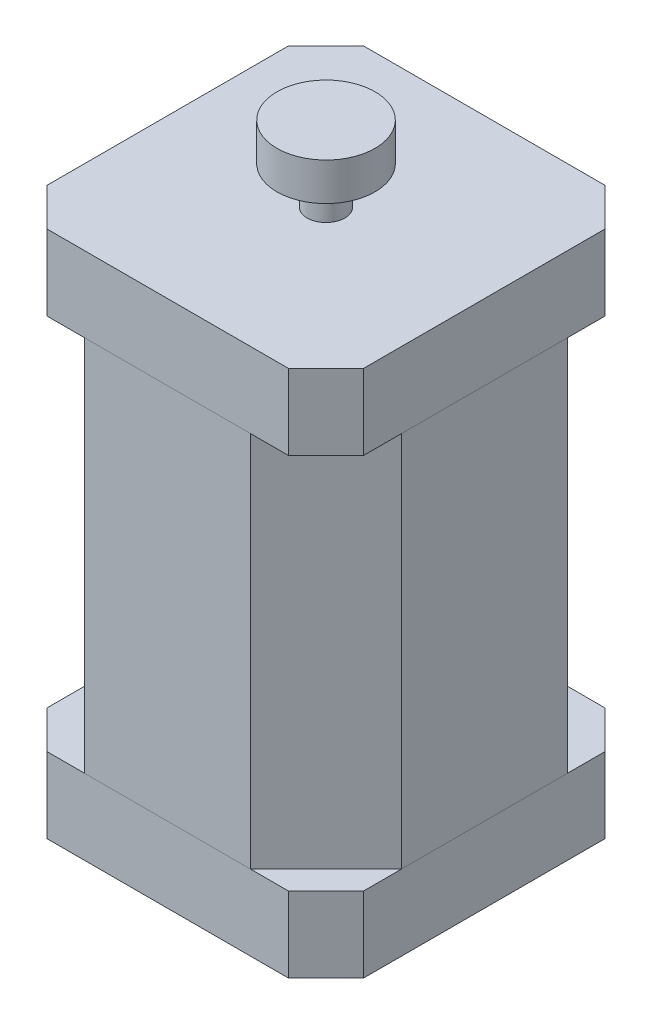
ISO-10303-21;
HEADER;
FILE_DESCRIPTION(('STEP AP214'),'2;1');
FILE_NAME('part.step','',(''),(''),'','','');
FILE_SCHEMA(('AUTOMOTIVE_DESIGN { 1 0 10303 214 1 1 1 1 }'));
ENDSEC;
DATA;
#1=APPLICATION_CONTEXT('core data for automotive mechanical design processes');
#2=APPLICATION_PROTOCOL_DEFINITION('international standard','automotive_design',2000,#1);
#3=PRODUCT_CONTEXT('',#1,'mechanical');
#4=PRODUCT('Part','Part','',(#3));
#5=PRODUCT_RELATED_PRODUCT_CATEGORY('part','',(#4));
#6=PRODUCT_DEFINITION_FORMATION('','',#4);
#7=PRODUCT_DEFINITION_CONTEXT('part definition',#1,'design');
#8=PRODUCT_DEFINITION('design','',#6,#7);
#9=PRODUCT_DEFINITION_SHAPE('','',#8);
#10=(LENGTH_UNIT() NAMED_UNIT(*) SI_UNIT(.MILLI.,.METRE.));
#11=(NAMED_UNIT(*) PLANE_ANGLE_UNIT() SI_UNIT($,.RADIAN.));
#12=(NAMED_UNIT(*) SI_UNIT($,.STERADIAN.) SOLID_ANGLE_UNIT());
#13=UNCERTAINTY_MEASURE_WITH_UNIT(LENGTH_MEASURE(1.E-05),#10,'distance_accuracy_value','');
#14=(GEOMETRIC_REPRESENTATION_CONTEXT(3) GLOBAL_UNCERTAINTY_ASSIGNED_CONTEXT((#13)) GLOBAL_UNIT_ASSIGNED_CONTEXT((#10,
#11,#12)) REPRESENTATION_CONTEXT('',''));
#15=CARTESIAN_POINT('',(0.,0.,0.));
#16=DIRECTION('',(0.,0.,1.));
#17=DIRECTION('',(1.,0.,0.));
#18=AXIS2_PLACEMENT_3D('',#15,#16,#17);
#19=CARTESIAN_POINT('',(0.,-10.,0.));
#20=DIRECTION('',(1.,0.,0.));
#21=DIRECTION('',(0.,0.,-1.));
#22=AXIS2_PLACEMENT_3D('',#19,#20,#21);
#23=PLANE('',#22);
#24=DIRECTION('',(0.,0.,-1.));
#25=VECTOR('',#24,1.);
#26=CARTESIAN_POINT('',(0.,0.,0.));
#27=LINE('',#26,#25);
#28=CARTESIAN_POINT('',(0.,0.,37.));
#29=VERTEX_POINT('',#28);
#30=CARTESIAN_POINT('',(0.,0.,5.00000000000002));
#31=VERTEX_POINT('',#30);
#32=EDGE_CURVE('E139',#29,#31,#27,.T.);
#33=ORIENTED_EDGE('',*,*,#32,.T.);
#34=DIRECTION('',(0.,-1.,0.));
#35=VECTOR('',#34,1.);
#36=CARTESIAN_POINT('',(0.,-10.,5.00000000000002));
#37=LINE('',#36,#35);
#38=CARTESIAN_POINT('',(0.,-10.,5.00000000000002));
#39=VERTEX_POINT('',#38);
#40=EDGE_CURVE('E116',#31,#39,#37,.T.);
#41=ORIENTED_EDGE('',*,*,#40,.T.);
#42=DIRECTION('',(0.,0.,-1.));
#43=VECTOR('',#42,1.);
#44=CARTESIAN_POINT('',(0.,-10.,0.));
#45=LINE('',#44,#43);
#46=CARTESIAN_POINT('',(0.,-10.,37.));
#47=VERTEX_POINT('',#46);
#48=EDGE_CURVE('E148',#47,#39,#45,.T.);
#49=ORIENTED_EDGE('',*,*,#48,.F.);
#50=DIRECTION('',(0.,1.,0.));
#51=VECTOR('',#50,1.);
#52=CARTESIAN_POINT('',(0.,-10.,37.));
#53=LINE('',#52,#51);
#54=EDGE_CURVE('E121',#47,#29,#53,.T.);
#55=ORIENTED_EDGE('',*,*,#54,.T.);
#56=EDGE_LOOP('',(#33,#41,#49,#55));
#57=FACE_BOUND('',#56,.T.);
#58=ADVANCED_FACE('F44',(#57),#23,.F.);
#59=CARTESIAN_POINT('',(0.,-10.,0.));
#60=DIRECTION('',(0.,0.,1.));
#61=DIRECTION('',(1.,0.,0.));
#62=AXIS2_PLACEMENT_3D('',#59,#60,#61);
#63=PLANE('',#62);
#64=DIRECTION('',(1.,0.,0.));
#65=VECTOR('',#64,1.);
#66=CARTESIAN_POINT('',(0.,-10.,0.));
#67=LINE('',#66,#65);
#68=CARTESIAN_POINT('',(5.,-10.,0.));
#69=VERTEX_POINT('',#68);
#70=CARTESIAN_POINT('',(37.,-10.,0.));
#71=VERTEX_POINT('',#70);
#72=EDGE_CURVE('E131',#69,#71,#67,.T.);
#73=ORIENTED_EDGE('',*,*,#72,.F.);
#74=DIRECTION('',(0.,1.,0.));
#75=VECTOR('',#74,1.);
#76=CARTESIAN_POINT('',(5.,-10.,0.));
#77=LINE('',#76,#75);
#78=CARTESIAN_POINT('',(5.,0.,0.));
#79=VERTEX_POINT('',#78);
#80=EDGE_CURVE('E115',#69,#79,#77,.T.);
#81=ORIENTED_EDGE('',*,*,#80,.T.);
#82=DIRECTION('',(1.,0.,0.));
#83=VECTOR('',#82,1.);
#84=CARTESIAN_POINT('',(0.,0.,0.));
#85=LINE('',#84,#83);
#86=CARTESIAN_POINT('',(37.,0.,0.));
#87=VERTEX_POINT('',#86);
#88=EDGE_CURVE('E128',#79,#87,#85,.T.);
#89=ORIENTED_EDGE('',*,*,#88,.T.);
#90=DIRECTION('',(0.,-1.,0.));
#91=VECTOR('',#90,1.);
#92=CARTESIAN_POINT('',(37.,-10.,0.));
#93=LINE('',#92,#91);
#94=EDGE_CURVE('E133',#87,#71,#93,.T.);
#95=ORIENTED_EDGE('',*,*,#94,.T.);
#96=EDGE_LOOP('',(#73,#81,#89,#95));
#97=FACE_BOUND('',#96,.T.);
#98=ADVANCED_FACE('F127',(#97),#63,.F.);
#99=CARTESIAN_POINT('',(42.,-10.,0.));
#100=DIRECTION('',(-1.,0.,0.));
#101=DIRECTION('',(0.,0.,1.));
#102=AXIS2_PLACEMENT_3D('',#99,#100,#101);
#103=PLANE('',#102);
#104=DIRECTION('',(0.,0.,1.));
#105=VECTOR('',#104,1.);
#106=CARTESIAN_POINT('',(42.,-10.,0.));
#107=LINE('',#106,#105);
#108=CARTESIAN_POINT('',(42.,-10.,5.));
#109=VERTEX_POINT('',#108);
#110=CARTESIAN_POINT('',(42.,-10.,37.));
#111=VERTEX_POINT('',#110);
#112=EDGE_CURVE('E171',#109,#111,#107,.T.);
#113=ORIENTED_EDGE('',*,*,#112,.F.);
#114=DIRECTION('',(0.,1.,0.));
#115=VECTOR('',#114,1.);
#116=CARTESIAN_POINT('',(42.,-10.,5.));
#117=LINE('',#116,#115);
#118=CARTESIAN_POINT('',(42.,0.,5.00000000000001));
#119=VERTEX_POINT('',#118);
#120=EDGE_CURVE('E12',#109,#119,#117,.T.);
#121=ORIENTED_EDGE('',*,*,#120,.T.);
#122=DIRECTION('',(0.,0.,1.));
#123=VECTOR('',#122,1.);
#124=CARTESIAN_POINT('',(42.,0.,0.));
#125=LINE('',#124,#123);
#126=CARTESIAN_POINT('',(42.,0.,37.));
#127=VERTEX_POINT('',#126);
#128=EDGE_CURVE('E138',#119,#127,#125,.T.);
#129=ORIENTED_EDGE('',*,*,#128,.T.);
#130=DIRECTION('',(0.,-1.,0.));
#131=VECTOR('',#130,1.);
#132=CARTESIAN_POINT('',(42.,-10.,37.));
#133=LINE('',#132,#131);
#134=EDGE_CURVE('E52',#127,#111,#133,.T.);
#135=ORIENTED_EDGE('',*,*,#134,.T.);
#136=EDGE_LOOP('',(#113,#121,#129,#135));
#137=FACE_BOUND('',#136,.T.);
#138=ADVANCED_FACE('F170',(#137),#103,.F.);
#139=CARTESIAN_POINT('',(0.,-10.,42.));
#140=DIRECTION('',(0.,0.,-1.));
#141=DIRECTION('',(-1.,0.,0.));
#142=AXIS2_PLACEMENT_3D('',#139,#140,#141);
#143=PLANE('',#142);
#144=DIRECTION('',(-1.,0.,0.));
#145=VECTOR('',#144,1.);
#146=CARTESIAN_POINT('',(0.,0.,42.));
#147=LINE('',#146,#145);
#148=CARTESIAN_POINT('',(37.,0.,42.));
#149=VERTEX_POINT('',#148);
#150=CARTESIAN_POINT('',(5.00000000000002,0.,42.));
#151=VERTEX_POINT('',#150);
#152=EDGE_CURVE('E142',#149,#151,#147,.T.);
#153=ORIENTED_EDGE('',*,*,#152,.T.);
#154=DIRECTION('',(0.,-1.,0.));
#155=VECTOR('',#154,1.);
#156=CARTESIAN_POINT('',(5.00000000000002,-10.,42.));
#157=LINE('',#156,#155);
#158=CARTESIAN_POINT('',(5.00000000000003,-10.,42.));
#159=VERTEX_POINT('',#158);
#160=EDGE_CURVE('E59',#151,#159,#157,.T.);
#161=ORIENTED_EDGE('',*,*,#160,.T.);
#162=DIRECTION('',(-1.,0.,0.));
#163=VECTOR('',#162,1.);
#164=CARTESIAN_POINT('',(0.,-10.,42.));
#165=LINE('',#164,#163);
#166=CARTESIAN_POINT('',(37.,-10.,42.));
#167=VERTEX_POINT('',#166);
#168=EDGE_CURVE('E149',#167,#159,#165,.T.);
#169=ORIENTED_EDGE('',*,*,#168,.F.);
#170=DIRECTION('',(0.,1.,0.));
#171=VECTOR('',#170,1.);
#172=CARTESIAN_POINT('',(37.,-10.,42.));
#173=LINE('',#172,#171);
#174=EDGE_CURVE('E164',#167,#149,#173,.T.);
#175=ORIENTED_EDGE('',*,*,#174,.T.);
#176=EDGE_LOOP('',(#153,#161,#169,#175));
#177=FACE_BOUND('',#176,.T.);
#178=ADVANCED_FACE('F180',(#177),#143,.F.);
#179=CARTESIAN_POINT('',(0.,-10.,0.));
#180=DIRECTION('',(0.,1.,0.));
#181=DIRECTION('',(0.,0.,1.));
#182=AXIS2_PLACEMENT_3D('',#179,#180,#181);
#183=PLANE('',#182);
#184=ORIENTED_EDGE('',*,*,#48,.T.);
#185=DIRECTION('',(-0.707106781186547,0.,0.707106781186549));
#186=VECTOR('',#185,1.);
#187=CARTESIAN_POINT('',(5.,-10.,0.));
#188=LINE('',#187,#186);
#189=EDGE_CURVE('E162',#39,#69,#188,.F.);
#190=ORIENTED_EDGE('',*,*,#189,.T.);
#191=ORIENTED_EDGE('',*,*,#72,.T.);
#192=DIRECTION('',(-0.707106781186549,0.,-0.707106781186547));
#193=VECTOR('',#192,1.);
#194=CARTESIAN_POINT('',(42.,-10.,5.));
#195=LINE('',#194,#193);
#196=EDGE_CURVE('E158',#71,#109,#195,.F.);
#197=ORIENTED_EDGE('',*,*,#196,.T.);
#198=ORIENTED_EDGE('',*,*,#112,.T.);
#199=DIRECTION('',(0.707106781186546,0.,-0.70710678118655));
#200=VECTOR('',#199,1.);
#201=CARTESIAN_POINT('',(37.,-10.,42.));
#202=LINE('',#201,#200);
#203=EDGE_CURVE('E66',#111,#167,#202,.F.);
#204=ORIENTED_EDGE('',*,*,#203,.T.);
#205=ORIENTED_EDGE('',*,*,#168,.T.);
#206=DIRECTION('',(0.70710678118655,0.,0.707106781186546));
#207=VECTOR('',#206,1.);
#208=CARTESIAN_POINT('',(0.,-10.,37.));
#209=LINE('',#208,#207);
#210=EDGE_CURVE('E160',#159,#47,#209,.F.);
#211=ORIENTED_EDGE('',*,*,#210,.T.);
#212=EDGE_LOOP('',(#184,#190,#191,#197,#198,#204,#205,#211));
#213=FACE_BOUND('',#212,.T.);
#214=ADVANCED_FACE('F175',(#213),#183,.F.);
#215=CARTESIAN_POINT('',(0.,0.,0.));
#216=DIRECTION('',(0.,1.,0.));
#217=DIRECTION('',(0.,0.,1.));
#218=AXIS2_PLACEMENT_3D('',#215,#216,#217);
#219=PLANE('',#218);
#220=ORIENTED_EDGE('',*,*,#88,.F.);
#221=DIRECTION('',(0.707106781186547,0.,-0.707106781186549));
#222=VECTOR('',#221,1.);
#223=CARTESIAN_POINT('',(2.50000000000001,0.,2.5));
#224=LINE('',#223,#222);
#225=EDGE_CURVE('E111',#79,#31,#224,.F.);
#226=ORIENTED_EDGE('',*,*,#225,.T.);
#227=ORIENTED_EDGE('',*,*,#32,.F.);
#228=DIRECTION('',(-0.70710678118655,0.,-0.707106781186546));
#229=VECTOR('',#228,1.);
#230=CARTESIAN_POINT('',(-18.5,0.,18.5000000000001));
#231=LINE('',#230,#229);
#232=EDGE_CURVE('E122',#29,#151,#231,.F.);
#233=ORIENTED_EDGE('',*,*,#232,.T.);
#234=ORIENTED_EDGE('',*,*,#152,.F.);
#235=DIRECTION('',(-0.707106781186546,0.,0.70710678118655));
#236=VECTOR('',#235,1.);
#237=CARTESIAN_POINT('',(39.5000000000001,0.,39.4999999999999));
#238=LINE('',#237,#236);
#239=EDGE_CURVE('E132',#149,#127,#238,.F.);
#240=ORIENTED_EDGE('',*,*,#239,.T.);
#241=ORIENTED_EDGE('',*,*,#128,.F.);
#242=DIRECTION('',(0.707106781186549,0.,0.707106781186547));
#243=VECTOR('',#242,1.);
#244=CARTESIAN_POINT('',(18.4999999999999,0.,-18.5));
#245=LINE('',#244,#243);
#246=EDGE_CURVE('E137',#119,#87,#245,.F.);
#247=ORIENTED_EDGE('',*,*,#246,.T.);
#248=EDGE_LOOP('',(#220,#226,#227,#233,#234,#240,#241,#247));
#249=FACE_BOUND('',#248,.T.);
#250=ADVANCED_FACE('F135',(#249),#219,.T.);
#251=CARTESIAN_POINT('',(5.,-10.,0.));
#252=DIRECTION('',(0.707106781186549,0.,0.707106781186547));
#253=DIRECTION('',(0.,1.,0.));
#254=AXIS2_PLACEMENT_3D('',#251,#252,#253);
#255=PLANE('',#254);
#256=ORIENTED_EDGE('',*,*,#189,.F.);
#257=ORIENTED_EDGE('',*,*,#40,.F.);
#258=ORIENTED_EDGE('',*,*,#225,.F.);
#259=ORIENTED_EDGE('',*,*,#80,.F.);
#260=EDGE_LOOP('',(#256,#257,#258,#259));
#261=FACE_BOUND('',#260,.T.);
#262=ADVANCED_FACE('F114',(#261),#255,.F.);
#263=CARTESIAN_POINT('',(0.,-10.,37.));
#264=DIRECTION('',(0.707106781186546,0.,-0.70710678118655));
#265=DIRECTION('',(0.,1.,0.));
#266=AXIS2_PLACEMENT_3D('',#263,#264,#265);
#267=PLANE('',#266);
#268=ORIENTED_EDGE('',*,*,#210,.F.);
#269=ORIENTED_EDGE('',*,*,#160,.F.);
#270=ORIENTED_EDGE('',*,*,#232,.F.);
#271=ORIENTED_EDGE('',*,*,#54,.F.);
#272=EDGE_LOOP('',(#268,#269,#270,#271));
#273=FACE_BOUND('',#272,.T.);
#274=ADVANCED_FACE('F184',(#273),#267,.F.);
#275=CARTESIAN_POINT('',(42.,-10.,5.));
#276=DIRECTION('',(-0.707106781186547,0.,0.707106781186549));
#277=DIRECTION('',(0.,1.,0.));
#278=AXIS2_PLACEMENT_3D('',#275,#276,#277);
#279=PLANE('',#278);
#280=ORIENTED_EDGE('',*,*,#196,.F.);
#281=ORIENTED_EDGE('',*,*,#94,.F.);
#282=ORIENTED_EDGE('',*,*,#246,.F.);
#283=ORIENTED_EDGE('',*,*,#120,.F.);
#284=EDGE_LOOP('',(#280,#281,#282,#283));
#285=FACE_BOUND('',#284,.T.);
#286=ADVANCED_FACE('F190',(#285),#279,.F.);
#287=CARTESIAN_POINT('',(37.,-10.,42.));
#288=DIRECTION('',(-0.70710678118655,0.,-0.707106781186546));
#289=DIRECTION('',(0.,1.,0.));
#290=AXIS2_PLACEMENT_3D('',#287,#288,#289);
#291=PLANE('',#290);
#292=ORIENTED_EDGE('',*,*,#203,.F.);
#293=ORIENTED_EDGE('',*,*,#134,.F.);
#294=ORIENTED_EDGE('',*,*,#239,.F.);
#295=ORIENTED_EDGE('',*,*,#174,.F.);
#296=EDGE_LOOP('',(#292,#293,#294,#295));
#297=FACE_BOUND('',#296,.T.);
#298=ADVANCED_FACE('F46',(#297),#291,.F.);
#299=CLOSED_SHELL('',(#58,#98,#138,#178,#214,#250,#262,#274,#286,#298));
#300=MANIFOLD_SOLID_BREP('B2',#299);
#301=CARTESIAN_POINT('',(21.,70.,21.));
#302=DIRECTION('',(0.,-1.,0.));
#303=DIRECTION('',(0.,0.,-1.));
#304=AXIS2_PLACEMENT_3D('',#301,#302,#303);
#305=CYLINDRICAL_SURFACE('',#304,2.5);
#306=CARTESIAN_POINT('',(21.,60.,21.));
#307=DIRECTION('',(0.,-1.,0.));
#308=DIRECTION('',(0.,0.,-1.));
#309=AXIS2_PLACEMENT_3D('',#306,#307,#308);
#310=CIRCLE('',#309,2.5);
#311=CARTESIAN_POINT('',(21.,60.,18.5));
#312=VERTEX_POINT('',#311);
#313=EDGE_CURVE('E289',#312,#312,#310,.F.);
#314=ORIENTED_EDGE('',*,*,#313,.T.);
#315=EDGE_LOOP('',(#314));
#316=FACE_BOUND('',#315,.T.);
#317=CARTESIAN_POINT('',(21.,65.,21.));
#318=DIRECTION('',(0.,1.,0.));
#319=DIRECTION('',(0.,0.,1.));
#320=AXIS2_PLACEMENT_3D('',#317,#318,#319);
#321=CIRCLE('',#320,2.5);
#322=CARTESIAN_POINT('',(21.,65.,23.5));
#323=VERTEX_POINT('',#322);
#324=EDGE_CURVE('E42',#323,#323,#321,.T.);
#325=ORIENTED_EDGE('',*,*,#324,.F.);
#326=EDGE_LOOP('',(#325));
#327=FACE_BOUND('',#326,.T.);
#328=ADVANCED_FACE('F281',(#316,#327),#305,.T.);
#329=CARTESIAN_POINT('',(0.,60.,0.));
#330=DIRECTION('',(0.,-1.,0.));
#331=DIRECTION('',(0.,0.,-1.));
#332=AXIS2_PLACEMENT_3D('',#329,#330,#331);
#333=PLANE('',#332);
#334=DIRECTION('',(0.,0.,-1.));
#335=VECTOR('',#334,1.);
#336=CARTESIAN_POINT('',(42.,60.,42.));
#337=LINE('',#336,#335);
#338=CARTESIAN_POINT('',(42.,60.,37.));
#339=VERTEX_POINT('',#338);
#340=CARTESIAN_POINT('',(42.,60.,5.00000000000004));
#341=VERTEX_POINT('',#340);
#342=EDGE_CURVE('E461',#339,#341,#337,.T.);
#343=ORIENTED_EDGE('',*,*,#342,.T.);
#344=DIRECTION('',(0.707106781186546,0.,0.70710678118655));
#345=VECTOR('',#344,1.);
#346=CARTESIAN_POINT('',(37.,60.,0.));
#347=LINE('',#346,#345);
#348=CARTESIAN_POINT('',(37.,60.,0.));
#349=VERTEX_POINT('',#348);
#350=EDGE_CURVE('E396',#341,#349,#347,.F.);
#351=ORIENTED_EDGE('',*,*,#350,.T.);
#352=DIRECTION('',(-1.,0.,0.));
#353=VECTOR('',#352,1.);
#354=CARTESIAN_POINT('',(0.,60.,0.));
#355=LINE('',#354,#353);
#356=CARTESIAN_POINT('',(5.00000000000003,60.,0.));
#357=VERTEX_POINT('',#356);
#358=EDGE_CURVE('E368',#349,#357,#355,.T.);
#359=ORIENTED_EDGE('',*,*,#358,.T.);
#360=DIRECTION('',(0.707106781186549,0.,-0.707106781186546));
#361=VECTOR('',#360,1.);
#362=CARTESIAN_POINT('',(0.,60.,5.));
#363=LINE('',#362,#361);
#364=CARTESIAN_POINT('',(0.,60.,5.));
#365=VERTEX_POINT('',#364);
#366=EDGE_CURVE('E393',#357,#365,#363,.F.);
#367=ORIENTED_EDGE('',*,*,#366,.T.);
#368=DIRECTION('',(0.,0.,1.));
#369=VECTOR('',#368,1.);
#370=CARTESIAN_POINT('',(0.,60.,42.));
#371=LINE('',#370,#369);
#372=CARTESIAN_POINT('',(0.,60.,37.));
#373=VERTEX_POINT('',#372);
#374=EDGE_CURVE('E375',#365,#373,#371,.T.);
#375=ORIENTED_EDGE('',*,*,#374,.T.);
#376=DIRECTION('',(-0.707106781186547,0.,-0.707106781186549));
#377=VECTOR('',#376,1.);
#378=CARTESIAN_POINT('',(5.,60.,42.));
#379=LINE('',#378,#377);
#380=CARTESIAN_POINT('',(5.,60.,42.));
#381=VERTEX_POINT('',#380);
#382=EDGE_CURVE('E303',#373,#381,#379,.F.);
#383=ORIENTED_EDGE('',*,*,#382,.T.);
#384=DIRECTION('',(1.,0.,0.));
#385=VECTOR('',#384,1.);
#386=CARTESIAN_POINT('',(0.,60.,42.));
#387=LINE('',#386,#385);
#388=CARTESIAN_POINT('',(37.,60.,42.));
#389=VERTEX_POINT('',#388);
#390=EDGE_CURVE('E378',#381,#389,#387,.T.);
#391=ORIENTED_EDGE('',*,*,#390,.T.);
#392=DIRECTION('',(-0.70710678118655,0.,0.707106781186546));
#393=VECTOR('',#392,1.);
#394=CARTESIAN_POINT('',(42.,60.,37.));
#395=LINE('',#394,#393);
#396=EDGE_CURVE('E391',#389,#339,#395,.F.);
#397=ORIENTED_EDGE('',*,*,#396,.T.);
#398=EDGE_LOOP('',(#343,#351,#359,#367,#375,#383,#391,#397));
#399=FACE_BOUND('',#398,.T.);
#400=ORIENTED_EDGE('',*,*,#313,.F.);
#401=EDGE_LOOP('',(#400));
#402=FACE_BOUND('',#401,.T.);
#403=ADVANCED_FACE('F411',(#399,#402),#333,.F.);
#404=CARTESIAN_POINT('',(0.,60.,42.));
#405=DIRECTION('',(1.,0.,0.));
#406=DIRECTION('',(0.,0.,-1.));
#407=AXIS2_PLACEMENT_3D('',#404,#405,#406);
#408=PLANE('',#407);
#409=DIRECTION('',(0.,0.,1.));
#410=VECTOR('',#409,1.);
#411=CARTESIAN_POINT('',(0.,50.,42.));
#412=LINE('',#411,#410);
#413=CARTESIAN_POINT('',(0.,50.,5.00000000000001));
#414=VERTEX_POINT('',#413);
#415=CARTESIAN_POINT('',(0.,50.,37.));
#416=VERTEX_POINT('',#415);
#417=EDGE_CURVE('E454',#414,#416,#412,.T.);
#418=ORIENTED_EDGE('',*,*,#417,.T.);
#419=DIRECTION('',(0.,1.,0.));
#420=VECTOR('',#419,1.);
#421=CARTESIAN_POINT('',(0.,60.,37.));
#422=LINE('',#421,#420);
#423=EDGE_CURVE('E405',#416,#373,#422,.T.);
#424=ORIENTED_EDGE('',*,*,#423,.T.);
#425=ORIENTED_EDGE('',*,*,#374,.F.);
#426=DIRECTION('',(0.,-1.,0.));
#427=VECTOR('',#426,1.);
#428=CARTESIAN_POINT('',(0.,60.,5.));
#429=LINE('',#428,#427);
#430=EDGE_CURVE('E402',#365,#414,#429,.T.);
#431=ORIENTED_EDGE('',*,*,#430,.T.);
#432=EDGE_LOOP('',(#418,#424,#425,#431));
#433=FACE_BOUND('',#432,.T.);
#434=ADVANCED_FACE('F413',(#433),#408,.F.);
#435=CARTESIAN_POINT('',(0.,60.,42.));
#436=DIRECTION('',(0.,0.,-1.));
#437=DIRECTION('',(-1.,0.,0.));
#438=AXIS2_PLACEMENT_3D('',#435,#436,#437);
#439=PLANE('',#438);
#440=ORIENTED_EDGE('',*,*,#390,.F.);
#441=DIRECTION('',(0.,-1.,0.));
#442=VECTOR('',#441,1.);
#443=CARTESIAN_POINT('',(5.,60.,42.));
#444=LINE('',#443,#442);
#445=CARTESIAN_POINT('',(5.00000000000001,50.,42.));
#446=VERTEX_POINT('',#445);
#447=EDGE_CURVE('E399',#381,#446,#444,.T.);
#448=ORIENTED_EDGE('',*,*,#447,.T.);
#449=DIRECTION('',(1.,0.,0.));
#450=VECTOR('',#449,1.);
#451=CARTESIAN_POINT('',(0.,50.,42.));
#452=LINE('',#451,#450);
#453=CARTESIAN_POINT('',(37.,50.,42.));
#454=VERTEX_POINT('',#453);
#455=EDGE_CURVE('E380',#446,#454,#452,.T.);
#456=ORIENTED_EDGE('',*,*,#455,.T.);
#457=DIRECTION('',(0.,1.,0.));
#458=VECTOR('',#457,1.);
#459=CARTESIAN_POINT('',(37.,60.,42.));
#460=LINE('',#459,#458);
#461=EDGE_CURVE('E296',#454,#389,#460,.T.);
#462=ORIENTED_EDGE('',*,*,#461,.T.);
#463=EDGE_LOOP('',(#440,#448,#456,#462));
#464=FACE_BOUND('',#463,.T.);
#465=ADVANCED_FACE('F419',(#464),#439,.F.);
#466=CARTESIAN_POINT('',(42.,60.,42.));
#467=DIRECTION('',(-1.,0.,0.));
#468=DIRECTION('',(0.,0.,1.));
#469=AXIS2_PLACEMENT_3D('',#466,#467,#468);
#470=PLANE('',#469);
#471=DIRECTION('',(0.,0.,-1.));
#472=VECTOR('',#471,1.);
#473=CARTESIAN_POINT('',(42.,50.,42.));
#474=LINE('',#473,#472);
#475=CARTESIAN_POINT('',(42.,50.,37.));
#476=VERTEX_POINT('',#475);
#477=CARTESIAN_POINT('',(42.,50.,5.00000000000004));
#478=VERTEX_POINT('',#477);
#479=EDGE_CURVE('E376',#476,#478,#474,.T.);
#480=ORIENTED_EDGE('',*,*,#479,.T.);
#481=DIRECTION('',(0.,1.,0.));
#482=VECTOR('',#481,1.);
#483=CARTESIAN_POINT('',(42.,60.,5.00000000000002));
#484=LINE('',#483,#482);
#485=EDGE_CURVE('E353',#478,#341,#484,.T.);
#486=ORIENTED_EDGE('',*,*,#485,.T.);
#487=ORIENTED_EDGE('',*,*,#342,.F.);
#488=DIRECTION('',(0.,-1.,0.));
#489=VECTOR('',#488,1.);
#490=CARTESIAN_POINT('',(42.,60.,37.));
#491=LINE('',#490,#489);
#492=EDGE_CURVE('E358',#339,#476,#491,.T.);
#493=ORIENTED_EDGE('',*,*,#492,.T.);
#494=EDGE_LOOP('',(#480,#486,#487,#493));
#495=FACE_BOUND('',#494,.T.);
#496=ADVANCED_FACE('F430',(#495),#470,.F.);
#497=CARTESIAN_POINT('',(0.,60.,0.));
#498=DIRECTION('',(0.,0.,1.));
#499=DIRECTION('',(1.,0.,0.));
#500=AXIS2_PLACEMENT_3D('',#497,#498,#499);
#501=PLANE('',#500);
#502=ORIENTED_EDGE('',*,*,#358,.F.);
#503=DIRECTION('',(0.,-1.,0.));
#504=VECTOR('',#503,1.);
#505=CARTESIAN_POINT('',(37.,60.,0.));
#506=LINE('',#505,#504);
#507=CARTESIAN_POINT('',(37.,50.,0.));
#508=VERTEX_POINT('',#507);
#509=EDGE_CURVE('E352',#349,#508,#506,.T.);
#510=ORIENTED_EDGE('',*,*,#509,.T.);
#511=DIRECTION('',(-1.,0.,0.));
#512=VECTOR('',#511,1.);
#513=CARTESIAN_POINT('',(0.,50.,0.));
#514=LINE('',#513,#512);
#515=CARTESIAN_POINT('',(5.00000000000002,50.,0.));
#516=VERTEX_POINT('',#515);
#517=EDGE_CURVE('E365',#508,#516,#514,.T.);
#518=ORIENTED_EDGE('',*,*,#517,.T.);
#519=DIRECTION('',(0.,1.,0.));
#520=VECTOR('',#519,1.);
#521=CARTESIAN_POINT('',(5.00000000000003,60.,0.));
#522=LINE('',#521,#520);
#523=EDGE_CURVE('E370',#516,#357,#522,.T.);
#524=ORIENTED_EDGE('',*,*,#523,.T.);
#525=EDGE_LOOP('',(#502,#510,#518,#524));
#526=FACE_BOUND('',#525,.T.);
#527=ADVANCED_FACE('F364',(#526),#501,.F.);
#528=CARTESIAN_POINT('',(0.,50.,0.));
#529=DIRECTION('',(0.,-1.,0.));
#530=DIRECTION('',(0.,0.,-1.));
#531=AXIS2_PLACEMENT_3D('',#528,#529,#530);
#532=PLANE('',#531);
#533=ORIENTED_EDGE('',*,*,#517,.F.);
#534=DIRECTION('',(-0.707106781186546,0.,-0.70710678118655));
#535=VECTOR('',#534,1.);
#536=CARTESIAN_POINT('',(18.5000000000001,50.,-18.5));
#537=LINE('',#536,#535);
#538=EDGE_CURVE('E348',#508,#478,#537,.F.);
#539=ORIENTED_EDGE('',*,*,#538,.T.);
#540=ORIENTED_EDGE('',*,*,#479,.F.);
#541=DIRECTION('',(0.70710678118655,0.,-0.707106781186546));
#542=VECTOR('',#541,1.);
#543=CARTESIAN_POINT('',(39.4999999999999,50.,39.5000000000001));
#544=LINE('',#543,#542);
#545=EDGE_CURVE('E369',#476,#454,#544,.F.);
#546=ORIENTED_EDGE('',*,*,#545,.T.);
#547=ORIENTED_EDGE('',*,*,#455,.F.);
#548=DIRECTION('',(0.707106781186547,0.,0.707106781186549));
#549=VECTOR('',#548,1.);
#550=CARTESIAN_POINT('',(-18.5,50.,18.4999999999999));
#551=LINE('',#550,#549);
#552=EDGE_CURVE('E359',#446,#416,#551,.F.);
#553=ORIENTED_EDGE('',*,*,#552,.T.);
#554=ORIENTED_EDGE('',*,*,#417,.F.);
#555=DIRECTION('',(-0.707106781186549,0.,0.707106781186546));
#556=VECTOR('',#555,1.);
#557=CARTESIAN_POINT('',(2.5,50.,2.50000000000001));
#558=LINE('',#557,#556);
#559=EDGE_CURVE('E374',#414,#516,#558,.F.);
#560=ORIENTED_EDGE('',*,*,#559,.T.);
#561=EDGE_LOOP('',(#533,#539,#540,#546,#547,#553,#554,#560));
#562=FACE_BOUND('',#561,.T.);
#563=ADVANCED_FACE('F372',(#562),#532,.T.);
#564=CARTESIAN_POINT('',(37.,60.,0.));
#565=DIRECTION('',(-0.70710678118655,0.,0.707106781186546));
#566=DIRECTION('',(0.,-1.,0.));
#567=AXIS2_PLACEMENT_3D('',#564,#565,#566);
#568=PLANE('',#567);
#569=ORIENTED_EDGE('',*,*,#350,.F.);
#570=ORIENTED_EDGE('',*,*,#485,.F.);
#571=ORIENTED_EDGE('',*,*,#538,.F.);
#572=ORIENTED_EDGE('',*,*,#509,.F.);
#573=EDGE_LOOP('',(#569,#570,#571,#572));
#574=FACE_BOUND('',#573,.T.);
#575=ADVANCED_FACE('F351',(#574),#568,.F.);
#576=CARTESIAN_POINT('',(5.,60.,42.));
#577=DIRECTION('',(0.707106781186549,0.,-0.707106781186547));
#578=DIRECTION('',(0.,-1.,0.));
#579=AXIS2_PLACEMENT_3D('',#576,#577,#578);
#580=PLANE('',#579);
#581=ORIENTED_EDGE('',*,*,#382,.F.);
#582=ORIENTED_EDGE('',*,*,#423,.F.);
#583=ORIENTED_EDGE('',*,*,#552,.F.);
#584=ORIENTED_EDGE('',*,*,#447,.F.);
#585=EDGE_LOOP('',(#581,#582,#583,#584));
#586=FACE_BOUND('',#585,.T.);
#587=ADVANCED_FACE('F438',(#586),#580,.F.);
#588=CARTESIAN_POINT('',(0.,60.,5.));
#589=DIRECTION('',(0.707106781186546,0.,0.707106781186549));
#590=DIRECTION('',(0.,-1.,0.));
#591=AXIS2_PLACEMENT_3D('',#588,#589,#590);
#592=PLANE('',#591);
#593=ORIENTED_EDGE('',*,*,#366,.F.);
#594=ORIENTED_EDGE('',*,*,#523,.F.);
#595=ORIENTED_EDGE('',*,*,#559,.F.);
#596=ORIENTED_EDGE('',*,*,#430,.F.);
#597=EDGE_LOOP('',(#593,#594,#595,#596));
#598=FACE_BOUND('',#597,.T.);
#599=ADVANCED_FACE('F440',(#598),#592,.F.);
#600=CARTESIAN_POINT('',(42.,60.,37.));
#601=DIRECTION('',(-0.707106781186546,0.,-0.70710678118655));
#602=DIRECTION('',(0.,-1.,0.));
#603=AXIS2_PLACEMENT_3D('',#600,#601,#602);
#604=PLANE('',#603);
#605=ORIENTED_EDGE('',*,*,#396,.F.);
#606=ORIENTED_EDGE('',*,*,#461,.F.);
#607=ORIENTED_EDGE('',*,*,#545,.F.);
#608=ORIENTED_EDGE('',*,*,#492,.F.);
#609=EDGE_LOOP('',(#605,#606,#607,#608));
#610=FACE_BOUND('',#609,.T.);
#611=ADVANCED_FACE('F283',(#610),#604,.F.);
#612=CARTESIAN_POINT('',(21.,65.,21.));
#613=DIRECTION('',(0.,1.,0.));
#614=DIRECTION('',(0.,0.,1.));
#615=AXIS2_PLACEMENT_3D('',#612,#613,#614);
#616=PLANE('',#615);
#617=CARTESIAN_POINT('',(21.,65.,21.));
#618=DIRECTION('',(0.,1.,0.));
#619=DIRECTION('',(0.,0.,1.));
#620=AXIS2_PLACEMENT_3D('',#617,#618,#619);
#621=CIRCLE('',#620,6.5);
#622=CARTESIAN_POINT('',(21.,65.,27.5));
#623=VERTEX_POINT('',#622);
#624=EDGE_CURVE('E457',#623,#623,#621,.T.);
#625=ORIENTED_EDGE('',*,*,#624,.F.);
#626=EDGE_LOOP('',(#625));
#627=FACE_BOUND('',#626,.T.);
#628=ORIENTED_EDGE('',*,*,#324,.T.);
#629=EDGE_LOOP('',(#628));
#630=FACE_BOUND('',#629,.T.);
#631=ADVANCED_FACE('F447',(#627,#630),#616,.F.);
#632=CARTESIAN_POINT('',(21.,65.,21.));
#633=DIRECTION('',(0.,1.,0.));
#634=DIRECTION('',(0.,0.,1.));
#635=AXIS2_PLACEMENT_3D('',#632,#633,#634);
#636=CYLINDRICAL_SURFACE('',#635,6.5);
#637=ORIENTED_EDGE('',*,*,#624,.T.);
#638=EDGE_LOOP('',(#637));
#639=FACE_BOUND('',#638,.T.);
#640=CARTESIAN_POINT('',(21.,70.,21.));
#641=DIRECTION('',(0.,1.,0.));
#642=DIRECTION('',(0.,0.,1.));
#643=AXIS2_PLACEMENT_3D('',#640,#641,#642);
#644=CIRCLE('',#643,6.5);
#645=CARTESIAN_POINT('',(21.,70.,27.5));
#646=VERTEX_POINT('',#645);
#647=EDGE_CURVE('E464',#646,#646,#644,.T.);
#648=ORIENTED_EDGE('',*,*,#647,.F.);
#649=EDGE_LOOP('',(#648));
#650=FACE_BOUND('',#649,.T.);
#651=ADVANCED_FACE('F470',(#639,#650),#636,.T.);
#652=CARTESIAN_POINT('',(21.,70.,21.));
#653=DIRECTION('',(0.,1.,0.));
#654=DIRECTION('',(0.,0.,1.));
#655=AXIS2_PLACEMENT_3D('',#652,#653,#654);
#656=PLANE('',#655);
#657=ORIENTED_EDGE('',*,*,#647,.T.);
#658=EDGE_LOOP('',(#657));
#659=FACE_BOUND('',#658,.T.);
#660=ADVANCED_FACE('F480',(#659),#656,.T.);
#661=CLOSED_SHELL('',(#328,#403,#434,#465,#496,#527,#563,#575,#587,#599,#611,#631,#651,#660));
#662=MANIFOLD_SOLID_BREP('B6',#661);
#663=CARTESIAN_POINT('',(0.,0.,42.));
#664=DIRECTION('',(1.,0.,0.));
#665=DIRECTION('',(0.,0.,-1.));
#666=AXIS2_PLACEMENT_3D('',#663,#664,#665);
#667=PLANE('',#666);
#668=DIRECTION('',(0.,0.,-1.));
#669=VECTOR('',#668,1.);
#670=CARTESIAN_POINT('',(0.,50.,42.));
#671=LINE('',#670,#669);
#672=CARTESIAN_POINT('',(0.,50.,32.));
#673=VERTEX_POINT('',#672);
#674=CARTESIAN_POINT('',(0.,50.,9.99999999999999));
#675=VERTEX_POINT('',#674);
#676=EDGE_CURVE('E693',#673,#675,#671,.T.);
#677=ORIENTED_EDGE('',*,*,#676,.T.);
#678=DIRECTION('',(0.,-1.,0.));
#679=VECTOR('',#678,1.);
#680=CARTESIAN_POINT('',(0.,0.,9.99999999999999));
#681=LINE('',#680,#679);
#682=CARTESIAN_POINT('',(0.,0.,9.99999999999999));
#683=VERTEX_POINT('',#682);
#684=EDGE_CURVE('E657',#675,#683,#681,.T.);
#685=ORIENTED_EDGE('',*,*,#684,.T.);
#686=DIRECTION('',(0.,0.,-1.));
#687=VECTOR('',#686,1.);
#688=CARTESIAN_POINT('',(0.,0.,42.));
#689=LINE('',#688,#687);
#690=CARTESIAN_POINT('',(0.,0.,32.));
#691=VERTEX_POINT('',#690);
#692=EDGE_CURVE('E642',#691,#683,#689,.T.);
#693=ORIENTED_EDGE('',*,*,#692,.F.);
#694=DIRECTION('',(0.,1.,0.));
#695=VECTOR('',#694,1.);
#696=CARTESIAN_POINT('',(0.,0.,32.));
#697=LINE('',#696,#695);
#698=EDGE_CURVE('E654',#691,#673,#697,.T.);
#699=ORIENTED_EDGE('',*,*,#698,.T.);
#700=EDGE_LOOP('',(#677,#685,#693,#699));
#701=FACE_BOUND('',#700,.T.);
#702=ADVANCED_FACE('F572',(#701),#667,.F.);
#703=CARTESIAN_POINT('',(0.,0.,42.));
#704=DIRECTION('',(0.,1.,0.));
#705=DIRECTION('',(0.,0.,1.));
#706=AXIS2_PLACEMENT_3D('',#703,#704,#705);
#707=PLANE('',#706);
#708=ORIENTED_EDGE('',*,*,#692,.T.);
#709=DIRECTION('',(0.707106781186549,0.,-0.707106781186546));
#710=VECTOR('',#709,1.);
#711=CARTESIAN_POINT('',(0.,0.,9.99999999999999));
#712=LINE('',#711,#710);
#713=CARTESIAN_POINT('',(10.,0.,0.));
#714=VERTEX_POINT('',#713);
#715=EDGE_CURVE('E669',#683,#714,#712,.T.);
#716=ORIENTED_EDGE('',*,*,#715,.T.);
#717=DIRECTION('',(1.,0.,0.));
#718=VECTOR('',#717,1.);
#719=CARTESIAN_POINT('',(0.,0.,0.));
#720=LINE('',#719,#718);
#721=CARTESIAN_POINT('',(32.,0.,0.));
#722=VERTEX_POINT('',#721);
#723=EDGE_CURVE('E700',#714,#722,#720,.T.);
#724=ORIENTED_EDGE('',*,*,#723,.T.);
#725=DIRECTION('',(0.707106781186548,0.,0.707106781186547));
#726=VECTOR('',#725,1.);
#727=CARTESIAN_POINT('',(42.,0.,10.));
#728=LINE('',#727,#726);
#729=CARTESIAN_POINT('',(42.,0.,10.));
#730=VERTEX_POINT('',#729);
#731=EDGE_CURVE('E648',#722,#730,#728,.T.);
#732=ORIENTED_EDGE('',*,*,#731,.T.);
#733=DIRECTION('',(0.,0.,-1.));
#734=VECTOR('',#733,1.);
#735=CARTESIAN_POINT('',(42.,0.,42.));
#736=LINE('',#735,#734);
#737=CARTESIAN_POINT('',(42.,0.,32.));
#738=VERTEX_POINT('',#737);
#739=EDGE_CURVE('E658',#738,#730,#736,.T.);
#740=ORIENTED_EDGE('',*,*,#739,.F.);
#741=DIRECTION('',(0.707106781186546,0.,-0.707106781186549));
#742=VECTOR('',#741,1.);
#743=CARTESIAN_POINT('',(32.,0.,42.));
#744=LINE('',#743,#742);
#745=CARTESIAN_POINT('',(32.,0.,42.));
#746=VERTEX_POINT('',#745);
#747=EDGE_CURVE('E649',#738,#746,#744,.F.);
#748=ORIENTED_EDGE('',*,*,#747,.T.);
#749=DIRECTION('',(1.,0.,0.));
#750=VECTOR('',#749,1.);
#751=CARTESIAN_POINT('',(0.,0.,42.));
#752=LINE('',#751,#750);
#753=CARTESIAN_POINT('',(10.,0.,42.));
#754=VERTEX_POINT('',#753);
#755=EDGE_CURVE('E644',#754,#746,#752,.T.);
#756=ORIENTED_EDGE('',*,*,#755,.F.);
#757=DIRECTION('',(0.707106781186546,0.,0.707106781186549));
#758=VECTOR('',#757,1.);
#759=CARTESIAN_POINT('',(10.,0.,42.));
#760=LINE('',#759,#758);
#761=EDGE_CURVE('E639',#754,#691,#760,.F.);
#762=ORIENTED_EDGE('',*,*,#761,.T.);
#763=EDGE_LOOP('',(#708,#716,#724,#732,#740,#748,#756,#762));
#764=FACE_BOUND('',#763,.T.);
#765=ADVANCED_FACE('F641',(#764),#707,.F.);
#766=CARTESIAN_POINT('',(42.,0.,42.));
#767=DIRECTION('',(-1.,0.,0.));
#768=DIRECTION('',(0.,0.,1.));
#769=AXIS2_PLACEMENT_3D('',#766,#767,#768);
#770=PLANE('',#769);
#771=ORIENTED_EDGE('',*,*,#739,.T.);
#772=DIRECTION('',(0.,1.,0.));
#773=VECTOR('',#772,1.);
#774=CARTESIAN_POINT('',(42.,50.,10.));
#775=LINE('',#774,#773);
#776=CARTESIAN_POINT('',(42.,50.,10.));
#777=VERTEX_POINT('',#776);
#778=EDGE_CURVE('E682',#730,#777,#775,.T.);
#779=ORIENTED_EDGE('',*,*,#778,.T.);
#780=DIRECTION('',(0.,0.,-1.));
#781=VECTOR('',#780,1.);
#782=CARTESIAN_POINT('',(42.,50.,42.));
#783=LINE('',#782,#781);
#784=CARTESIAN_POINT('',(42.,50.,32.));
#785=VERTEX_POINT('',#784);
#786=EDGE_CURVE('E695',#785,#777,#783,.T.);
#787=ORIENTED_EDGE('',*,*,#786,.F.);
#788=DIRECTION('',(0.,-1.,0.));
#789=VECTOR('',#788,1.);
#790=CARTESIAN_POINT('',(42.,0.,32.));
#791=LINE('',#790,#789);
#792=EDGE_CURVE('E680',#785,#738,#791,.T.);
#793=ORIENTED_EDGE('',*,*,#792,.T.);
#794=EDGE_LOOP('',(#771,#779,#787,#793));
#795=FACE_BOUND('',#794,.T.);
#796=ADVANCED_FACE('F707',(#795),#770,.F.);
#797=CARTESIAN_POINT('',(0.,50.,42.));
#798=DIRECTION('',(0.,-1.,0.));
#799=DIRECTION('',(0.,0.,-1.));
#800=AXIS2_PLACEMENT_3D('',#797,#798,#799);
#801=PLANE('',#800);
#802=DIRECTION('',(-1.,0.,0.));
#803=VECTOR('',#802,1.);
#804=CARTESIAN_POINT('',(0.,50.,0.));
#805=LINE('',#804,#803);
#806=CARTESIAN_POINT('',(31.9999999999999,50.,0.));
#807=VERTEX_POINT('',#806);
#808=CARTESIAN_POINT('',(10.,50.,0.));
#809=VERTEX_POINT('',#808);
#810=EDGE_CURVE('E697',#807,#809,#805,.T.);
#811=ORIENTED_EDGE('',*,*,#810,.T.);
#812=DIRECTION('',(-0.707106781186549,0.,0.707106781186546));
#813=VECTOR('',#812,1.);
#814=CARTESIAN_POINT('',(0.,50.,9.99999999999999));
#815=LINE('',#814,#813);
#816=EDGE_CURVE('E678',#809,#675,#815,.T.);
#817=ORIENTED_EDGE('',*,*,#816,.T.);
#818=ORIENTED_EDGE('',*,*,#676,.F.);
#819=DIRECTION('',(-0.707106781186546,0.,-0.707106781186549));
#820=VECTOR('',#819,1.);
#821=CARTESIAN_POINT('',(10.,50.,42.));
#822=LINE('',#821,#820);
#823=CARTESIAN_POINT('',(10.,50.,42.));
#824=VERTEX_POINT('',#823);
#825=EDGE_CURVE('E662',#673,#824,#822,.F.);
#826=ORIENTED_EDGE('',*,*,#825,.T.);
#827=DIRECTION('',(-1.,0.,0.));
#828=VECTOR('',#827,1.);
#829=CARTESIAN_POINT('',(0.,50.,42.));
#830=LINE('',#829,#828);
#831=CARTESIAN_POINT('',(32.,50.,42.));
#832=VERTEX_POINT('',#831);
#833=EDGE_CURVE('E688',#832,#824,#830,.T.);
#834=ORIENTED_EDGE('',*,*,#833,.F.);
#835=DIRECTION('',(-0.707106781186546,0.,0.707106781186549));
#836=VECTOR('',#835,1.);
#837=CARTESIAN_POINT('',(32.,50.,42.));
#838=LINE('',#837,#836);
#839=EDGE_CURVE('E595',#832,#785,#838,.F.);
#840=ORIENTED_EDGE('',*,*,#839,.T.);
#841=ORIENTED_EDGE('',*,*,#786,.T.);
#842=DIRECTION('',(-0.707106781186548,0.,-0.707106781186547));
#843=VECTOR('',#842,1.);
#844=CARTESIAN_POINT('',(42.,50.,10.));
#845=LINE('',#844,#843);
#846=EDGE_CURVE('E587',#777,#807,#845,.T.);
#847=ORIENTED_EDGE('',*,*,#846,.T.);
#848=EDGE_LOOP('',(#811,#817,#818,#826,#834,#840,#841,#847));
#849=FACE_BOUND('',#848,.T.);
#850=ADVANCED_FACE('F692',(#849),#801,.F.);
#851=CARTESIAN_POINT('',(0.,0.,42.));
#852=DIRECTION('',(0.,0.,-1.));
#853=DIRECTION('',(-1.,0.,0.));
#854=AXIS2_PLACEMENT_3D('',#851,#852,#853);
#855=PLANE('',#854);
#856=ORIENTED_EDGE('',*,*,#833,.T.);
#857=DIRECTION('',(0.,-1.,0.));
#858=VECTOR('',#857,1.);
#859=CARTESIAN_POINT('',(10.,0.,42.));
#860=LINE('',#859,#858);
#861=EDGE_CURVE('E279',#824,#754,#860,.T.);
#862=ORIENTED_EDGE('',*,*,#861,.T.);
#863=ORIENTED_EDGE('',*,*,#755,.T.);
#864=DIRECTION('',(0.,1.,0.));
#865=VECTOR('',#864,1.);
#866=CARTESIAN_POINT('',(32.,0.,42.));
#867=LINE('',#866,#865);
#868=EDGE_CURVE('E580',#746,#832,#867,.T.);
#869=ORIENTED_EDGE('',*,*,#868,.T.);
#870=EDGE_LOOP('',(#856,#862,#863,#869));
#871=FACE_BOUND('',#870,.T.);
#872=ADVANCED_FACE('F687',(#871),#855,.F.);
#873=CARTESIAN_POINT('',(0.,0.,0.));
#874=DIRECTION('',(0.,0.,-1.));
#875=DIRECTION('',(-1.,0.,0.));
#876=AXIS2_PLACEMENT_3D('',#873,#874,#875);
#877=PLANE('',#876);
#878=ORIENTED_EDGE('',*,*,#723,.F.);
#879=DIRECTION('',(0.,1.,0.));
#880=VECTOR('',#879,1.);
#881=CARTESIAN_POINT('',(10.,50.,0.));
#882=LINE('',#881,#880);
#883=EDGE_CURVE('E673',#714,#809,#882,.T.);
#884=ORIENTED_EDGE('',*,*,#883,.T.);
#885=ORIENTED_EDGE('',*,*,#810,.F.);
#886=DIRECTION('',(0.,-1.,0.));
#887=VECTOR('',#886,1.);
#888=CARTESIAN_POINT('',(32.,0.,0.));
#889=LINE('',#888,#887);
#890=EDGE_CURVE('E671',#807,#722,#889,.T.);
#891=ORIENTED_EDGE('',*,*,#890,.T.);
#892=EDGE_LOOP('',(#878,#884,#885,#891));
#893=FACE_BOUND('',#892,.T.);
#894=ADVANCED_FACE('F714',(#893),#877,.T.);
#895=CARTESIAN_POINT('',(0.,0.,9.99999999999999));
#896=DIRECTION('',(-0.707106781186546,0.,-0.707106781186549));
#897=DIRECTION('',(0.,1.,0.));
#898=AXIS2_PLACEMENT_3D('',#895,#896,#897);
#899=PLANE('',#898);
#900=ORIENTED_EDGE('',*,*,#816,.F.);
#901=ORIENTED_EDGE('',*,*,#883,.F.);
#902=ORIENTED_EDGE('',*,*,#715,.F.);
#903=ORIENTED_EDGE('',*,*,#684,.F.);
#904=EDGE_LOOP('',(#900,#901,#902,#903));
#905=FACE_BOUND('',#904,.T.);
#906=ADVANCED_FACE('F718',(#905),#899,.T.);
#907=CARTESIAN_POINT('',(42.,0.,10.));
#908=DIRECTION('',(0.707106781186547,0.,-0.707106781186548));
#909=DIRECTION('',(0.,-1.,0.));
#910=AXIS2_PLACEMENT_3D('',#907,#908,#909);
#911=PLANE('',#910);
#912=ORIENTED_EDGE('',*,*,#731,.F.);
#913=ORIENTED_EDGE('',*,*,#890,.F.);
#914=ORIENTED_EDGE('',*,*,#846,.F.);
#915=ORIENTED_EDGE('',*,*,#778,.F.);
#916=EDGE_LOOP('',(#912,#913,#914,#915));
#917=FACE_BOUND('',#916,.T.);
#918=ADVANCED_FACE('F710',(#917),#911,.T.);
#919=CARTESIAN_POINT('',(10.,0.,42.));
#920=DIRECTION('',(0.707106781186549,0.,-0.707106781186546));
#921=DIRECTION('',(0.,-1.,0.));
#922=AXIS2_PLACEMENT_3D('',#919,#920,#921);
#923=PLANE('',#922);
#924=ORIENTED_EDGE('',*,*,#825,.F.);
#925=ORIENTED_EDGE('',*,*,#698,.F.);
#926=ORIENTED_EDGE('',*,*,#761,.F.);
#927=ORIENTED_EDGE('',*,*,#861,.F.);
#928=EDGE_LOOP('',(#924,#925,#926,#927));
#929=FACE_BOUND('',#928,.T.);
#930=ADVANCED_FACE('F661',(#929),#923,.F.);
#931=CARTESIAN_POINT('',(32.,0.,42.));
#932=DIRECTION('',(-0.707106781186549,0.,-0.707106781186546));
#933=DIRECTION('',(0.,1.,0.));
#934=AXIS2_PLACEMENT_3D('',#931,#932,#933);
#935=PLANE('',#934);
#936=ORIENTED_EDGE('',*,*,#747,.F.);
#937=ORIENTED_EDGE('',*,*,#792,.F.);
#938=ORIENTED_EDGE('',*,*,#839,.F.);
#939=ORIENTED_EDGE('',*,*,#868,.F.);
#940=EDGE_LOOP('',(#936,#937,#938,#939));
#941=FACE_BOUND('',#940,.T.);
#942=ADVANCED_FACE('F574',(#941),#935,.F.);
#943=CLOSED_SHELL('',(#702,#765,#796,#850,#872,#894,#906,#918,#930,#942));
#944=MANIFOLD_SOLID_BREP('B36',#943);
#945=ADVANCED_BREP_SHAPE_REPRESENTATION('',(#18,#300,#662,#944),#14);
#946=SHAPE_DEFINITION_REPRESENTATION(#9,#945);
ENDSEC;
END-ISO-10303-21;
